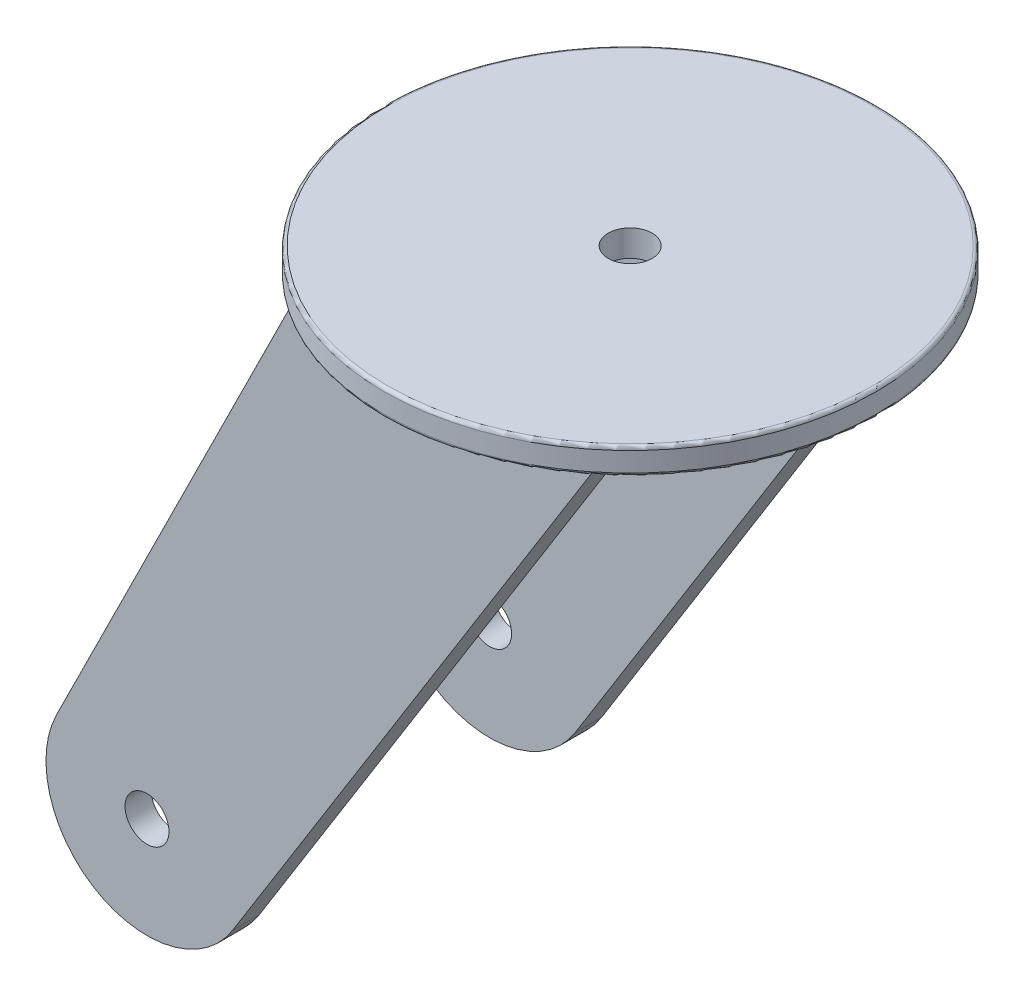
ISO-10303-21;
HEADER;
FILE_DESCRIPTION(('STEP AP214'),'2;1');
FILE_NAME('part.step','',(''),(''),'','','');
FILE_SCHEMA(('AUTOMOTIVE_DESIGN { 1 0 10303 214 1 1 1 1 }'));
ENDSEC;
DATA;
#1=APPLICATION_CONTEXT('core data for automotive mechanical design processes');
#2=APPLICATION_PROTOCOL_DEFINITION('international standard','automotive_design',2000,#1);
#3=PRODUCT_CONTEXT('',#1,'mechanical');
#4=PRODUCT('Part','Part','',(#3));
#5=PRODUCT_RELATED_PRODUCT_CATEGORY('part','',(#4));
#6=PRODUCT_DEFINITION_FORMATION('','',#4);
#7=PRODUCT_DEFINITION_CONTEXT('part definition',#1,'design');
#8=PRODUCT_DEFINITION('design','',#6,#7);
#9=PRODUCT_DEFINITION_SHAPE('','',#8);
#10=(LENGTH_UNIT() NAMED_UNIT(*) SI_UNIT(.MILLI.,.METRE.));
#11=(NAMED_UNIT(*) PLANE_ANGLE_UNIT() SI_UNIT($,.RADIAN.));
#12=(NAMED_UNIT(*) SI_UNIT($,.STERADIAN.) SOLID_ANGLE_UNIT());
#13=UNCERTAINTY_MEASURE_WITH_UNIT(LENGTH_MEASURE(1.E-05),#10,'distance_accuracy_value','');
#14=(GEOMETRIC_REPRESENTATION_CONTEXT(3) GLOBAL_UNCERTAINTY_ASSIGNED_CONTEXT((#13)) GLOBAL_UNIT_ASSIGNED_CONTEXT((#10,
#11,#12)) REPRESENTATION_CONTEXT('',''));
#15=CARTESIAN_POINT('',(0.,0.,0.));
#16=DIRECTION('',(0.,0.,1.));
#17=DIRECTION('',(1.,0.,0.));
#18=AXIS2_PLACEMENT_3D('',#15,#16,#17);
#19=CARTESIAN_POINT('',(0.,0.,0.));
#20=DIRECTION('',(0.,1.,0.));
#21=DIRECTION('',(0.,0.,1.));
#22=AXIS2_PLACEMENT_3D('',#19,#20,#21);
#23=PLANE('',#22);
#24=CARTESIAN_POINT('',(0.,0.,0.));
#25=DIRECTION('',(0.,1.,0.));
#26=DIRECTION('',(0.,0.,1.));
#27=AXIS2_PLACEMENT_3D('',#24,#25,#26);
#28=CIRCLE('',#27,6.35);
#29=CARTESIAN_POINT('',(0.,0.,6.35));
#30=VERTEX_POINT('',#29);
#31=EDGE_CURVE('E247',#30,#30,#28,.T.);
#32=ORIENTED_EDGE('',*,*,#31,.T.);
#33=EDGE_LOOP('',(#32));
#34=FACE_BOUND('',#33,.T.);
#35=DIRECTION('',(0.,0.,1.));
#36=VECTOR('',#35,1.);
#37=CARTESIAN_POINT('',(43.18,0.,-53.34));
#38=LINE('',#37,#36);
#39=CARTESIAN_POINT('',(43.18,0.,-53.34));
#40=VERTEX_POINT('',#39);
#41=CARTESIAN_POINT('',(43.18,0.,-45.72));
#42=VERTEX_POINT('',#41);
#43=EDGE_CURVE('E55',#40,#42,#38,.T.);
#44=ORIENTED_EDGE('',*,*,#43,.F.);
#45=DIRECTION('',(-1.,0.,0.));
#46=VECTOR('',#45,1.);
#47=CARTESIAN_POINT('',(0.,0.,-53.34));
#48=LINE('',#47,#46);
#49=CARTESIAN_POINT('',(-43.18,0.,-53.34));
#50=VERTEX_POINT('',#49);
#51=EDGE_CURVE('E59',#40,#50,#48,.T.);
#52=ORIENTED_EDGE('',*,*,#51,.T.);
#53=DIRECTION('',(0.,0.,1.));
#54=VECTOR('',#53,1.);
#55=CARTESIAN_POINT('',(-43.18,0.,-53.34));
#56=LINE('',#55,#54);
#57=CARTESIAN_POINT('',(-43.18,0.,-45.72));
#58=VERTEX_POINT('',#57);
#59=EDGE_CURVE('E129',#50,#58,#56,.T.);
#60=ORIENTED_EDGE('',*,*,#59,.T.);
#61=DIRECTION('',(-1.,0.,0.));
#62=VECTOR('',#61,1.);
#63=CARTESIAN_POINT('',(0.,0.,-45.72));
#64=LINE('',#63,#62);
#65=EDGE_CURVE('E133',#42,#58,#64,.T.);
#66=ORIENTED_EDGE('',*,*,#65,.F.);
#67=EDGE_LOOP('',(#44,#52,#60,#66));
#68=FACE_BOUND('',#67,.T.);
#69=CARTESIAN_POINT('',(0.,0.,0.));
#70=DIRECTION('',(0.,1.,0.));
#71=DIRECTION('',(0.,0.,1.));
#72=AXIS2_PLACEMENT_3D('',#69,#70,#71);
#73=CIRCLE('',#72,70.1294);
#74=CARTESIAN_POINT('',(0.,0.,70.1294));
#75=VERTEX_POINT('',#74);
#76=EDGE_CURVE('E48',#75,#75,#73,.F.);
#77=ORIENTED_EDGE('',*,*,#76,.T.);
#78=EDGE_LOOP('',(#77));
#79=FACE_BOUND('',#78,.T.);
#80=DIRECTION('',(0.,0.,-1.));
#81=VECTOR('',#80,1.);
#82=CARTESIAN_POINT('',(-43.18,0.,53.34));
#83=LINE('',#82,#81);
#84=CARTESIAN_POINT('',(-43.18,0.,53.34));
#85=VERTEX_POINT('',#84);
#86=CARTESIAN_POINT('',(-43.18,0.,45.72));
#87=VERTEX_POINT('',#86);
#88=EDGE_CURVE('E199',#85,#87,#83,.T.);
#89=ORIENTED_EDGE('',*,*,#88,.F.);
#90=DIRECTION('',(-1.,0.,0.));
#91=VECTOR('',#90,1.);
#92=CARTESIAN_POINT('',(0.,0.,53.34));
#93=LINE('',#92,#91);
#94=CARTESIAN_POINT('',(43.18,0.,53.34));
#95=VERTEX_POINT('',#94);
#96=EDGE_CURVE('E162',#95,#85,#93,.T.);
#97=ORIENTED_EDGE('',*,*,#96,.F.);
#98=DIRECTION('',(0.,0.,-1.));
#99=VECTOR('',#98,1.);
#100=CARTESIAN_POINT('',(43.18,0.,53.34));
#101=LINE('',#100,#99);
#102=CARTESIAN_POINT('',(43.18,0.,45.72));
#103=VERTEX_POINT('',#102);
#104=EDGE_CURVE('E177',#95,#103,#101,.T.);
#105=ORIENTED_EDGE('',*,*,#104,.T.);
#106=DIRECTION('',(-1.,0.,0.));
#107=VECTOR('',#106,1.);
#108=CARTESIAN_POINT('',(0.,0.,45.72));
#109=LINE('',#108,#107);
#110=EDGE_CURVE('E167',#103,#87,#109,.T.);
#111=ORIENTED_EDGE('',*,*,#110,.T.);
#112=EDGE_LOOP('',(#89,#97,#105,#111));
#113=FACE_BOUND('',#112,.T.);
#114=ADVANCED_FACE('F39',(#34,#68,#79,#113),#23,.F.);
#115=CARTESIAN_POINT('',(0.,7.62,0.));
#116=DIRECTION('',(0.,-1.,0.));
#117=DIRECTION('',(0.,0.,-1.));
#118=AXIS2_PLACEMENT_3D('',#115,#116,#117);
#119=CYLINDRICAL_SURFACE('',#118,71.12);
#120=CARTESIAN_POINT('',(0.,0.990599999999999,0.));
#121=DIRECTION('',(0.,1.,0.));
#122=DIRECTION('',(0.,0.,1.));
#123=AXIS2_PLACEMENT_3D('',#120,#121,#122);
#124=CIRCLE('',#123,71.12);
#125=CARTESIAN_POINT('',(0.,0.990599999999999,71.12));
#126=VERTEX_POINT('',#125);
#127=EDGE_CURVE('E207',#126,#126,#124,.T.);
#128=ORIENTED_EDGE('',*,*,#127,.T.);
#129=EDGE_LOOP('',(#128));
#130=FACE_BOUND('',#129,.T.);
#131=CARTESIAN_POINT('',(0.,6.6294,0.));
#132=DIRECTION('',(0.,1.,0.));
#133=DIRECTION('',(0.,0.,1.));
#134=AXIS2_PLACEMENT_3D('',#131,#132,#133);
#135=CIRCLE('',#134,71.12);
#136=CARTESIAN_POINT('',(0.,6.6294,71.12));
#137=VERTEX_POINT('',#136);
#138=EDGE_CURVE('E203',#137,#137,#135,.F.);
#139=ORIENTED_EDGE('',*,*,#138,.T.);
#140=EDGE_LOOP('',(#139));
#141=FACE_BOUND('',#140,.T.);
#142=ADVANCED_FACE('F222',(#130,#141),#119,.T.);
#143=CARTESIAN_POINT('',(0.,7.62,0.));
#144=DIRECTION('',(0.,1.,0.));
#145=DIRECTION('',(0.,0.,1.));
#146=AXIS2_PLACEMENT_3D('',#143,#144,#145);
#147=PLANE('',#146);
#148=CARTESIAN_POINT('',(0.,7.62,0.));
#149=DIRECTION('',(0.,1.,0.));
#150=DIRECTION('',(0.,0.,1.));
#151=AXIS2_PLACEMENT_3D('',#148,#149,#150);
#152=CIRCLE('',#151,6.35);
#153=CARTESIAN_POINT('',(0.,7.61999999999999,6.35));
#154=VERTEX_POINT('',#153);
#155=EDGE_CURVE('E251',#154,#154,#152,.T.);
#156=ORIENTED_EDGE('',*,*,#155,.F.);
#157=EDGE_LOOP('',(#156));
#158=FACE_BOUND('',#157,.T.);
#159=CARTESIAN_POINT('',(0.,7.62,0.));
#160=DIRECTION('',(0.,1.,0.));
#161=DIRECTION('',(0.,0.,1.));
#162=AXIS2_PLACEMENT_3D('',#159,#160,#161);
#163=CIRCLE('',#162,70.1294);
#164=CARTESIAN_POINT('',(0.,7.62,70.1294));
#165=VERTEX_POINT('',#164);
#166=EDGE_CURVE('E11',#165,#165,#163,.T.);
#167=ORIENTED_EDGE('',*,*,#166,.T.);
#168=EDGE_LOOP('',(#167));
#169=FACE_BOUND('',#168,.T.);
#170=ADVANCED_FACE('F219',(#158,#169),#147,.T.);
#171=CARTESIAN_POINT('',(0.,0.990599999999999,0.));
#172=DIRECTION('',(0.,1.,0.));
#173=DIRECTION('',(0.,0.,1.));
#174=AXIS2_PLACEMENT_3D('',#171,#172,#173);
#175=TOROIDAL_SURFACE('',#174,70.1294,0.9906);
#176=ORIENTED_EDGE('',*,*,#76,.F.);
#177=EDGE_LOOP('',(#176));
#178=FACE_BOUND('',#177,.T.);
#179=ORIENTED_EDGE('',*,*,#127,.F.);
#180=EDGE_LOOP('',(#179));
#181=FACE_BOUND('',#180,.T.);
#182=ADVANCED_FACE('F216',(#178,#181),#175,.T.);
#183=CARTESIAN_POINT('',(0.,6.6294,0.));
#184=DIRECTION('',(0.,1.,0.));
#185=DIRECTION('',(0.,0.,1.));
#186=AXIS2_PLACEMENT_3D('',#183,#184,#185);
#187=TOROIDAL_SURFACE('',#186,70.1294,0.9906);
#188=ORIENTED_EDGE('',*,*,#138,.F.);
#189=EDGE_LOOP('',(#188));
#190=FACE_BOUND('',#189,.T.);
#191=ORIENTED_EDGE('',*,*,#166,.F.);
#192=EDGE_LOOP('',(#191));
#193=FACE_BOUND('',#192,.T.);
#194=ADVANCED_FACE('F41',(#190,#193),#187,.T.);
#195=CARTESIAN_POINT('',(-86.36,-152.4,53.34));
#196=DIRECTION('',(0.,0.,1.));
#197=DIRECTION('',(1.,0.,0.));
#198=AXIS2_PLACEMENT_3D('',#195,#196,#197);
#199=PLANE('',#198);
#200=ORIENTED_EDGE('',*,*,#96,.T.);
#201=DIRECTION('',(-0.445350899786596,-0.89535611689387,0.));
#202=VECTOR('',#201,1.);
#203=CARTESIAN_POINT('',(-43.18,0.,53.34));
#204=LINE('',#203,#202);
#205=CARTESIAN_POINT('',(-112.51335217447,-139.391300217234,53.34));
#206=VERTEX_POINT('',#205);
#207=EDGE_CURVE('E166',#85,#206,#204,.T.);
#208=ORIENTED_EDGE('',*,*,#207,.T.);
#209=CARTESIAN_POINT('',(-86.36,-152.4,53.34));
#210=DIRECTION('',(0.,0.,1.));
#211=DIRECTION('',(1.,0.,0.));
#212=AXIS2_PLACEMENT_3D('',#209,#210,#211);
#213=CIRCLE('',#212,29.21);
#214=CARTESIAN_POINT('',(-61.5796372167252,-167.86472503245,53.34));
#215=VERTEX_POINT('',#214);
#216=EDGE_CURVE('E170',#206,#215,#213,.T.);
#217=ORIENTED_EDGE('',*,*,#216,.T.);
#218=DIRECTION('',(0.529432558454303,0.848352029554082,0.));
#219=VECTOR('',#218,1.);
#220=CARTESIAN_POINT('',(43.18,0.,53.34));
#221=LINE('',#220,#219);
#222=EDGE_CURVE('E173',#215,#95,#221,.T.);
#223=ORIENTED_EDGE('',*,*,#222,.T.);
#224=EDGE_LOOP('',(#200,#208,#217,#223));
#225=FACE_BOUND('',#224,.T.);
#226=CARTESIAN_POINT('',(-86.36,-152.4,53.34));
#227=DIRECTION('',(0.,0.,1.));
#228=DIRECTION('',(1.,0.,0.));
#229=AXIS2_PLACEMENT_3D('',#226,#227,#228);
#230=CIRCLE('',#229,6.34999999999999);
#231=CARTESIAN_POINT('',(-80.01,-152.4,53.34));
#232=VERTEX_POINT('',#231);
#233=EDGE_CURVE('E154',#232,#232,#230,.T.);
#234=ORIENTED_EDGE('',*,*,#233,.F.);
#235=EDGE_LOOP('',(#234));
#236=FACE_BOUND('',#235,.T.);
#237=ADVANCED_FACE('F230',(#225,#236),#199,.T.);
#238=CARTESIAN_POINT('',(-86.36,-152.4,45.72));
#239=DIRECTION('',(0.,0.,1.));
#240=DIRECTION('',(1.,0.,0.));
#241=AXIS2_PLACEMENT_3D('',#238,#239,#240);
#242=PLANE('',#241);
#243=DIRECTION('',(-0.445350899786596,-0.89535611689387,0.));
#244=VECTOR('',#243,1.);
#245=CARTESIAN_POINT('',(-43.18,0.,45.72));
#246=LINE('',#245,#244);
#247=CARTESIAN_POINT('',(-112.51335217447,-139.391300217234,45.72));
#248=VERTEX_POINT('',#247);
#249=EDGE_CURVE('E158',#87,#248,#246,.T.);
#250=ORIENTED_EDGE('',*,*,#249,.F.);
#251=ORIENTED_EDGE('',*,*,#110,.F.);
#252=DIRECTION('',(0.529432558454303,0.848352029554082,0.));
#253=VECTOR('',#252,1.);
#254=CARTESIAN_POINT('',(43.18,0.,45.72));
#255=LINE('',#254,#253);
#256=CARTESIAN_POINT('',(-61.5796372167252,-167.86472503245,45.72));
#257=VERTEX_POINT('',#256);
#258=EDGE_CURVE('E183',#257,#103,#255,.T.);
#259=ORIENTED_EDGE('',*,*,#258,.F.);
#260=CARTESIAN_POINT('',(-86.36,-152.4,45.72));
#261=DIRECTION('',(0.,0.,1.));
#262=DIRECTION('',(1.,0.,0.));
#263=AXIS2_PLACEMENT_3D('',#260,#261,#262);
#264=CIRCLE('',#263,29.21);
#265=EDGE_CURVE('E180',#248,#257,#264,.T.);
#266=ORIENTED_EDGE('',*,*,#265,.F.);
#267=EDGE_LOOP('',(#250,#251,#259,#266));
#268=FACE_BOUND('',#267,.T.);
#269=CARTESIAN_POINT('',(-86.36,-152.4,45.72));
#270=DIRECTION('',(0.,0.,1.));
#271=DIRECTION('',(1.,0.,0.));
#272=AXIS2_PLACEMENT_3D('',#269,#270,#271);
#273=CIRCLE('',#272,6.34999999999999);
#274=CARTESIAN_POINT('',(-80.01,-152.4,45.72));
#275=VERTEX_POINT('',#274);
#276=EDGE_CURVE('E153',#275,#275,#273,.T.);
#277=ORIENTED_EDGE('',*,*,#276,.T.);
#278=EDGE_LOOP('',(#277));
#279=FACE_BOUND('',#278,.T.);
#280=ADVANCED_FACE('F298',(#268,#279),#242,.F.);
#281=CARTESIAN_POINT('',(-43.18,0.,53.34));
#282=DIRECTION('',(0.89535611689387,-0.445350899786596,0.));
#283=DIRECTION('',(0.445350899786596,0.89535611689387,0.));
#284=AXIS2_PLACEMENT_3D('',#281,#282,#283);
#285=PLANE('',#284);
#286=ORIENTED_EDGE('',*,*,#249,.T.);
#287=DIRECTION('',(0.,0.,-1.));
#288=VECTOR('',#287,1.);
#289=CARTESIAN_POINT('',(-112.51335217447,-139.391300217234,53.34));
#290=LINE('',#289,#288);
#291=EDGE_CURVE('E195',#206,#248,#290,.T.);
#292=ORIENTED_EDGE('',*,*,#291,.F.);
#293=ORIENTED_EDGE('',*,*,#207,.F.);
#294=ORIENTED_EDGE('',*,*,#88,.T.);
#295=EDGE_LOOP('',(#286,#292,#293,#294));
#296=FACE_BOUND('',#295,.T.);
#297=ADVANCED_FACE('F302',(#296),#285,.F.);
#298=CARTESIAN_POINT('',(-86.36,-152.4,53.34));
#299=DIRECTION('',(0.,0.,-1.));
#300=DIRECTION('',(-1.,0.,0.));
#301=AXIS2_PLACEMENT_3D('',#298,#299,#300);
#302=CYLINDRICAL_SURFACE('',#301,29.21);
#303=ORIENTED_EDGE('',*,*,#265,.T.);
#304=DIRECTION('',(0.,0.,-1.));
#305=VECTOR('',#304,1.);
#306=CARTESIAN_POINT('',(-61.5796372167252,-167.86472503245,53.34));
#307=LINE('',#306,#305);
#308=EDGE_CURVE('E191',#215,#257,#307,.T.);
#309=ORIENTED_EDGE('',*,*,#308,.F.);
#310=ORIENTED_EDGE('',*,*,#216,.F.);
#311=ORIENTED_EDGE('',*,*,#291,.T.);
#312=EDGE_LOOP('',(#303,#309,#310,#311));
#313=FACE_BOUND('',#312,.T.);
#314=ADVANCED_FACE('F306',(#313),#302,.T.);
#315=CARTESIAN_POINT('',(43.18,0.,53.34));
#316=DIRECTION('',(-0.848352029554082,0.529432558454303,0.));
#317=DIRECTION('',(-0.529432558454303,-0.848352029554082,0.));
#318=AXIS2_PLACEMENT_3D('',#315,#316,#317);
#319=PLANE('',#318);
#320=ORIENTED_EDGE('',*,*,#258,.T.);
#321=ORIENTED_EDGE('',*,*,#104,.F.);
#322=ORIENTED_EDGE('',*,*,#222,.F.);
#323=ORIENTED_EDGE('',*,*,#308,.T.);
#324=EDGE_LOOP('',(#320,#321,#322,#323));
#325=FACE_BOUND('',#324,.T.);
#326=ADVANCED_FACE('F294',(#325),#319,.F.);
#327=CARTESIAN_POINT('',(-86.36,-152.4,53.34));
#328=DIRECTION('',(0.,0.,-1.));
#329=DIRECTION('',(-1.,0.,0.));
#330=AXIS2_PLACEMENT_3D('',#327,#328,#329);
#331=CYLINDRICAL_SURFACE('',#330,6.34999999999999);
#332=ORIENTED_EDGE('',*,*,#233,.T.);
#333=EDGE_LOOP('',(#332));
#334=FACE_BOUND('',#333,.T.);
#335=ORIENTED_EDGE('',*,*,#276,.F.);
#336=EDGE_LOOP('',(#335));
#337=FACE_BOUND('',#336,.T.);
#338=ADVANCED_FACE('F291',(#334,#337),#331,.F.);
#339=CARTESIAN_POINT('',(43.18,0.,-53.34));
#340=DIRECTION('',(0.848352029554082,-0.529432558454303,0.));
#341=DIRECTION('',(0.529432558454303,0.848352029554082,0.));
#342=AXIS2_PLACEMENT_3D('',#339,#340,#341);
#343=PLANE('',#342);
#344=DIRECTION('',(0.529432558454303,0.848352029554082,0.));
#345=VECTOR('',#344,1.);
#346=CARTESIAN_POINT('',(43.18,0.,-45.72));
#347=LINE('',#346,#345);
#348=CARTESIAN_POINT('',(-61.5796372167252,-167.86472503245,-45.72));
#349=VERTEX_POINT('',#348);
#350=EDGE_CURVE('E108',#349,#42,#347,.T.);
#351=ORIENTED_EDGE('',*,*,#350,.F.);
#352=DIRECTION('',(0.,0.,1.));
#353=VECTOR('',#352,1.);
#354=CARTESIAN_POINT('',(-61.5796372167252,-167.86472503245,-53.34));
#355=LINE('',#354,#353);
#356=CARTESIAN_POINT('',(-61.5796372167252,-167.86472503245,-53.34));
#357=VERTEX_POINT('',#356);
#358=EDGE_CURVE('E103',#357,#349,#355,.T.);
#359=ORIENTED_EDGE('',*,*,#358,.F.);
#360=DIRECTION('',(0.529432558454303,0.848352029554082,0.));
#361=VECTOR('',#360,1.);
#362=CARTESIAN_POINT('',(43.18,0.,-53.34));
#363=LINE('',#362,#361);
#364=EDGE_CURVE('E106',#357,#40,#363,.T.);
#365=ORIENTED_EDGE('',*,*,#364,.T.);
#366=ORIENTED_EDGE('',*,*,#43,.T.);
#367=EDGE_LOOP('',(#351,#359,#365,#366));
#368=FACE_BOUND('',#367,.T.);
#369=ADVANCED_FACE('F105',(#368),#343,.T.);
#370=CARTESIAN_POINT('',(-86.36,-152.4,-53.34));
#371=DIRECTION('',(0.,0.,1.));
#372=DIRECTION('',(1.,0.,0.));
#373=AXIS2_PLACEMENT_3D('',#370,#371,#372);
#374=CYLINDRICAL_SURFACE('',#373,29.21);
#375=CARTESIAN_POINT('',(-86.36,-152.4,-45.72));
#376=DIRECTION('',(0.,0.,1.));
#377=DIRECTION('',(1.,0.,0.));
#378=AXIS2_PLACEMENT_3D('',#375,#376,#377);
#379=CIRCLE('',#378,29.21);
#380=CARTESIAN_POINT('',(-112.51335217447,-139.391300217234,-45.72));
#381=VERTEX_POINT('',#380);
#382=EDGE_CURVE('E140',#381,#349,#379,.T.);
#383=ORIENTED_EDGE('',*,*,#382,.F.);
#384=DIRECTION('',(0.,0.,1.));
#385=VECTOR('',#384,1.);
#386=CARTESIAN_POINT('',(-112.51335217447,-139.391300217234,-53.34));
#387=LINE('',#386,#385);
#388=CARTESIAN_POINT('',(-112.51335217447,-139.391300217234,-53.34));
#389=VERTEX_POINT('',#388);
#390=EDGE_CURVE('E114',#389,#381,#387,.T.);
#391=ORIENTED_EDGE('',*,*,#390,.F.);
#392=CARTESIAN_POINT('',(-86.36,-152.4,-53.34));
#393=DIRECTION('',(0.,0.,1.));
#394=DIRECTION('',(1.,0.,0.));
#395=AXIS2_PLACEMENT_3D('',#392,#393,#394);
#396=CIRCLE('',#395,29.21);
#397=EDGE_CURVE('E120',#389,#357,#396,.T.);
#398=ORIENTED_EDGE('',*,*,#397,.T.);
#399=ORIENTED_EDGE('',*,*,#358,.T.);
#400=EDGE_LOOP('',(#383,#391,#398,#399));
#401=FACE_BOUND('',#400,.T.);
#402=ADVANCED_FACE('F124',(#401),#374,.T.);
#403=CARTESIAN_POINT('',(-43.18,0.,-53.34));
#404=DIRECTION('',(-0.89535611689387,0.445350899786596,0.));
#405=DIRECTION('',(-0.445350899786596,-0.89535611689387,0.));
#406=AXIS2_PLACEMENT_3D('',#403,#404,#405);
#407=PLANE('',#406);
#408=DIRECTION('',(-0.445350899786596,-0.89535611689387,0.));
#409=VECTOR('',#408,1.);
#410=CARTESIAN_POINT('',(-43.18,0.,-45.72));
#411=LINE('',#410,#409);
#412=EDGE_CURVE('E143',#58,#381,#411,.T.);
#413=ORIENTED_EDGE('',*,*,#412,.F.);
#414=ORIENTED_EDGE('',*,*,#59,.F.);
#415=DIRECTION('',(-0.445350899786596,-0.89535611689387,0.));
#416=VECTOR('',#415,1.);
#417=CARTESIAN_POINT('',(-43.18,0.,-53.34));
#418=LINE('',#417,#416);
#419=EDGE_CURVE('E126',#50,#389,#418,.T.);
#420=ORIENTED_EDGE('',*,*,#419,.T.);
#421=ORIENTED_EDGE('',*,*,#390,.T.);
#422=EDGE_LOOP('',(#413,#414,#420,#421));
#423=FACE_BOUND('',#422,.T.);
#424=ADVANCED_FACE('F279',(#423),#407,.T.);
#425=CARTESIAN_POINT('',(-86.36,-152.4,-53.34));
#426=DIRECTION('',(0.,0.,-1.));
#427=DIRECTION('',(1.,0.,0.));
#428=AXIS2_PLACEMENT_3D('',#425,#426,#427);
#429=PLANE('',#428);
#430=CARTESIAN_POINT('',(-86.36,-152.4,-53.34));
#431=DIRECTION('',(0.,0.,1.));
#432=DIRECTION('',(1.,0.,0.));
#433=AXIS2_PLACEMENT_3D('',#430,#431,#432);
#434=CIRCLE('',#433,6.34999999999999);
#435=CARTESIAN_POINT('',(-80.01,-152.4,-53.34));
#436=VERTEX_POINT('',#435);
#437=EDGE_CURVE('E137',#436,#436,#434,.T.);
#438=ORIENTED_EDGE('',*,*,#437,.T.);
#439=EDGE_LOOP('',(#438));
#440=FACE_BOUND('',#439,.T.);
#441=ORIENTED_EDGE('',*,*,#51,.F.);
#442=ORIENTED_EDGE('',*,*,#364,.F.);
#443=ORIENTED_EDGE('',*,*,#397,.F.);
#444=ORIENTED_EDGE('',*,*,#419,.F.);
#445=EDGE_LOOP('',(#441,#442,#443,#444));
#446=FACE_BOUND('',#445,.T.);
#447=ADVANCED_FACE('F118',(#440,#446),#429,.T.);
#448=CARTESIAN_POINT('',(-86.36,-152.4,-45.72));
#449=DIRECTION('',(0.,0.,-1.));
#450=DIRECTION('',(1.,0.,0.));
#451=AXIS2_PLACEMENT_3D('',#448,#449,#450);
#452=PLANE('',#451);
#453=CARTESIAN_POINT('',(-86.36,-152.4,-45.72));
#454=DIRECTION('',(0.,0.,1.));
#455=DIRECTION('',(1.,0.,0.));
#456=AXIS2_PLACEMENT_3D('',#453,#454,#455);
#457=CIRCLE('',#456,6.34999999999999);
#458=CARTESIAN_POINT('',(-80.01,-152.4,-45.72));
#459=VERTEX_POINT('',#458);
#460=EDGE_CURVE('E250',#459,#459,#457,.T.);
#461=ORIENTED_EDGE('',*,*,#460,.F.);
#462=EDGE_LOOP('',(#461));
#463=FACE_BOUND('',#462,.T.);
#464=ORIENTED_EDGE('',*,*,#65,.T.);
#465=ORIENTED_EDGE('',*,*,#412,.T.);
#466=ORIENTED_EDGE('',*,*,#382,.T.);
#467=ORIENTED_EDGE('',*,*,#350,.T.);
#468=EDGE_LOOP('',(#464,#465,#466,#467));
#469=FACE_BOUND('',#468,.T.);
#470=ADVANCED_FACE('F270',(#463,#469),#452,.F.);
#471=CARTESIAN_POINT('',(-86.36,-152.4,-53.34));
#472=DIRECTION('',(0.,0.,1.));
#473=DIRECTION('',(1.,0.,0.));
#474=AXIS2_PLACEMENT_3D('',#471,#472,#473);
#475=CYLINDRICAL_SURFACE('',#474,6.34999999999999);
#476=ORIENTED_EDGE('',*,*,#437,.F.);
#477=EDGE_LOOP('',(#476));
#478=FACE_BOUND('',#477,.T.);
#479=ORIENTED_EDGE('',*,*,#460,.T.);
#480=EDGE_LOOP('',(#479));
#481=FACE_BOUND('',#480,.T.);
#482=ADVANCED_FACE('F266',(#478,#481),#475,.F.);
#483=CARTESIAN_POINT('',(0.,-181.61,0.));
#484=DIRECTION('',(0.,1.,0.));
#485=DIRECTION('',(0.,0.,1.));
#486=AXIS2_PLACEMENT_3D('',#483,#484,#485);
#487=CYLINDRICAL_SURFACE('',#486,6.35);
#488=CARTESIAN_POINT('',(0.,7.61999999999999,6.35));
#489=CARTESIAN_POINT('',(0.,7.54062499999999,6.35));
#490=CARTESIAN_POINT('',(0.,7.46124999999998,6.35));
#491=CARTESIAN_POINT('',(0.,7.30249999999998,6.35));
#492=CARTESIAN_POINT('',(0.,7.22312499999998,6.35));
#493=CARTESIAN_POINT('',(0.,7.06437499999998,6.35));
#494=CARTESIAN_POINT('',(0.,6.98499999999999,6.35));
#495=CARTESIAN_POINT('',(0.,6.82625,6.35));
#496=CARTESIAN_POINT('',(0.,6.74687499999999,6.35));
#497=CARTESIAN_POINT('',(0.,6.58812499999999,6.35));
#498=CARTESIAN_POINT('',(0.,6.50874999999999,6.35));
#499=CARTESIAN_POINT('',(0.,6.34999999999999,6.35));
#500=CARTESIAN_POINT('',(0.,6.27062499999998,6.35));
#501=CARTESIAN_POINT('',(0.,6.11187499999998,6.35));
#502=CARTESIAN_POINT('',(0.,6.03249999999998,6.35));
#503=CARTESIAN_POINT('',(0.,5.87374999999998,6.35));
#504=CARTESIAN_POINT('',(0.,5.79437499999999,6.35));
#505=CARTESIAN_POINT('',(0.,5.635625,6.35));
#506=CARTESIAN_POINT('',(0.,5.55624999999999,6.35));
#507=CARTESIAN_POINT('',(0.,5.39749999999999,6.35));
#508=CARTESIAN_POINT('',(0.,5.31812499999999,6.35));
#509=CARTESIAN_POINT('',(0.,5.15937499999998,6.35));
#510=CARTESIAN_POINT('',(0.,5.07999999999998,6.35));
#511=CARTESIAN_POINT('',(0.,4.92124999999998,6.35));
#512=CARTESIAN_POINT('',(0.,4.84187499999998,6.35));
#513=CARTESIAN_POINT('',(0.,4.68312499999997,6.35));
#514=CARTESIAN_POINT('',(0.,4.60374999999997,6.35));
#515=CARTESIAN_POINT('',(0.,4.44499999999998,6.35));
#516=CARTESIAN_POINT('',(0.,4.36562499999998,6.35));
#517=CARTESIAN_POINT('',(0.,4.20687499999999,6.35));
#518=CARTESIAN_POINT('',(0.,4.12749999999999,6.35));
#519=CARTESIAN_POINT('',(0.,3.96874999999998,6.35));
#520=CARTESIAN_POINT('',(0.,3.88937499999998,6.35));
#521=CARTESIAN_POINT('',(0.,3.73062499999998,6.35));
#522=CARTESIAN_POINT('',(0.,3.65124999999998,6.35));
#523=CARTESIAN_POINT('',(0.,3.49249999999997,6.35));
#524=CARTESIAN_POINT('',(0.,3.41312499999997,6.35));
#525=CARTESIAN_POINT('',(0.,3.25437499999998,6.35));
#526=CARTESIAN_POINT('',(0.,3.17499999999998,6.35));
#527=CARTESIAN_POINT('',(0.,3.01624999999999,6.35));
#528=CARTESIAN_POINT('',(0.,2.93687499999999,6.35));
#529=CARTESIAN_POINT('',(0.,2.77812499999998,6.35));
#530=CARTESIAN_POINT('',(0.,2.69874999999998,6.35));
#531=CARTESIAN_POINT('',(0.,2.53999999999998,6.35));
#532=CARTESIAN_POINT('',(0.,2.46062499999998,6.35));
#533=CARTESIAN_POINT('',(0.,2.30187499999997,6.35));
#534=CARTESIAN_POINT('',(0.,2.22249999999997,6.35));
#535=CARTESIAN_POINT('',(0.,2.06374999999997,6.35));
#536=CARTESIAN_POINT('',(0.,1.98437499999996,6.35));
#537=CARTESIAN_POINT('',(0.,1.82562499999997,6.35));
#538=CARTESIAN_POINT('',(0.,1.74624999999998,6.35));
#539=CARTESIAN_POINT('',(0.,1.58749999999998,6.35));
#540=CARTESIAN_POINT('',(0.,1.50812499999998,6.35));
#541=CARTESIAN_POINT('',(0.,1.34937499999998,6.35));
#542=CARTESIAN_POINT('',(0.,1.26999999999997,6.35));
#543=CARTESIAN_POINT('',(0.,1.11124999999997,6.35));
#544=CARTESIAN_POINT('',(0.,1.03187499999997,6.35));
#545=CARTESIAN_POINT('',(0.,0.873124999999965,6.35));
#546=CARTESIAN_POINT('',(0.,0.793749999999963,6.35));
#547=CARTESIAN_POINT('',(0.,0.634999999999969,6.35));
#548=CARTESIAN_POINT('',(0.,0.555624999999976,6.35));
#549=CARTESIAN_POINT('',(0.,0.396874999999982,6.35));
#550=CARTESIAN_POINT('',(0.,0.31749999999998,6.35));
#551=CARTESIAN_POINT('',(0.,0.158749999999976,6.35));
#552=CARTESIAN_POINT('',(0.,0.0793749999999741,6.35));
#553=CARTESIAN_POINT('',(0.,0.,6.35));
#554=B_SPLINE_CURVE_WITH_KNOTS('',3,(#488,#489,#490,#491,#492,#493,#494,#495,#496,#497,#498,
#499,#500,#501,#502,#503,#504,#505,#506,#507,#508,#509,#510,#511,#512,#513,#514,#515,#516,#517,
#518,#519,#520,#521,#522,#523,#524,#525,#526,#527,#528,#529,#530,#531,#532,#533,#534,#535,#536,
#537,#538,#539,#540,#541,#542,#543,#544,#545,#546,#547,#548,#549,#550,#551,#552,#553),
.UNSPECIFIED.,.F.,.F.,(4,2,2,2,2,2,2,2,2,2,2,2,2,2,2,2,2,2,2,2,2,2,2,2,2,2,2,2,2,2,2,2,4),(0.,
0.238125000000006,0.476250000000011,0.714374999999989,0.952499999999995,1.190625,
1.42875000000001,1.66687500000001,1.90499999999999,2.143125,2.38125,2.61937500000001,
2.85750000000001,3.09562500000002,3.33375,3.571875,3.81000000000001,4.04812500000001,
4.28625000000002,4.524375,4.7625,5.00062500000001,5.23875000000001,5.47687500000002,
5.71500000000003,5.953125,6.19125000000001,6.42937500000001,6.66750000000002,6.90562500000003,
7.14375,7.38187500000001,7.62000000000002),.UNSPECIFIED.);
#555=EDGE_CURVE('BSEAM269',#154,#30,#554,.T.);
#556=ORIENTED_EDGE('',*,*,#155,.T.);
#557=ORIENTED_EDGE('',*,*,#31,.F.);
#558=ORIENTED_EDGE('',*,*,#555,.T.);
#559=ORIENTED_EDGE('',*,*,#555,.F.);
#560=EDGE_LOOP('',(#556,#558,#557,#559));
#561=FACE_BOUND('',#560,.T.);
#562=ADVANCED_FACE('F269',(#561),#487,.F.);
#563=CLOSED_SHELL('',(#114,#142,#170,#182,#194,#237,#280,#297,#314,#326,#338,#369,#402,#424,
#447,#470,#482,#562));
#564=MANIFOLD_SOLID_BREP('B2',#563);
#565=ADVANCED_BREP_SHAPE_REPRESENTATION('',(#18,#564),#14);
#566=SHAPE_DEFINITION_REPRESENTATION(#9,#565);
ENDSEC;
END-ISO-10303-21;
